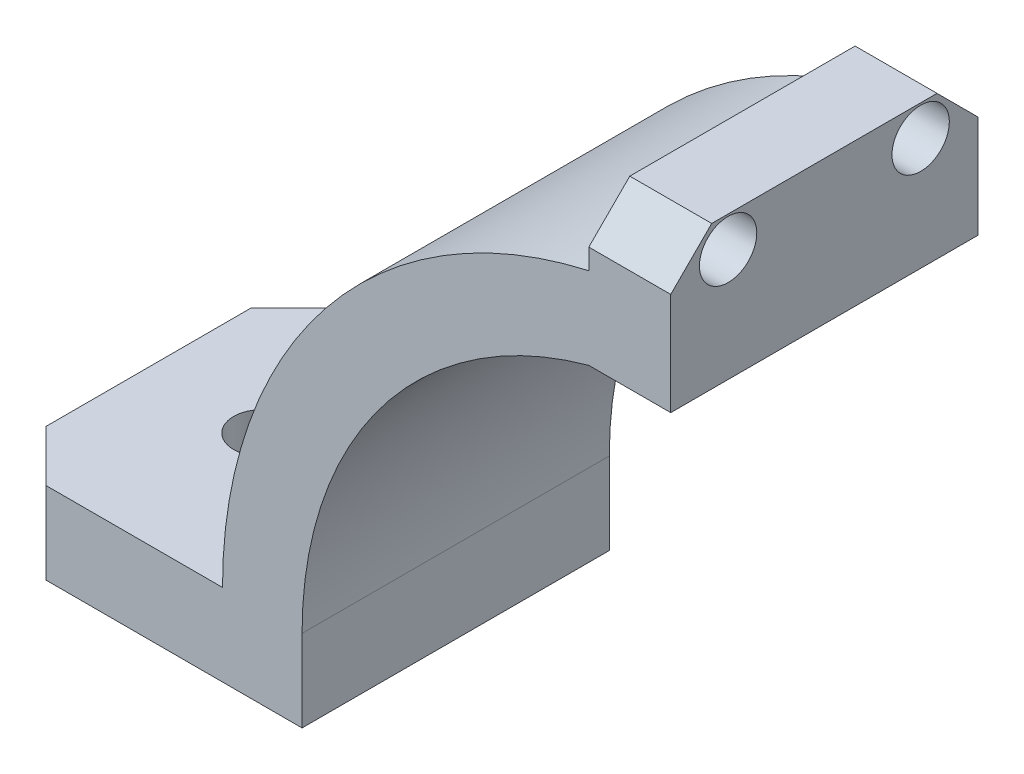
ISO-10303-21;
HEADER;
FILE_DESCRIPTION(('STEP AP214'),'2;1');
FILE_NAME('part.step','',(''),(''),'','','');
FILE_SCHEMA(('AUTOMOTIVE_DESIGN { 1 0 10303 214 1 1 1 1 }'));
ENDSEC;
DATA;
#1=APPLICATION_CONTEXT('core data for automotive mechanical design processes');
#2=APPLICATION_PROTOCOL_DEFINITION('international standard','automotive_design',2000,#1);
#3=PRODUCT_CONTEXT('',#1,'mechanical');
#4=PRODUCT('Part','Part','',(#3));
#5=PRODUCT_RELATED_PRODUCT_CATEGORY('part','',(#4));
#6=PRODUCT_DEFINITION_FORMATION('','',#4);
#7=PRODUCT_DEFINITION_CONTEXT('part definition',#1,'design');
#8=PRODUCT_DEFINITION('design','',#6,#7);
#9=PRODUCT_DEFINITION_SHAPE('','',#8);
#10=(LENGTH_UNIT() NAMED_UNIT(*) SI_UNIT(.MILLI.,.METRE.));
#11=(NAMED_UNIT(*) PLANE_ANGLE_UNIT() SI_UNIT($,.RADIAN.));
#12=(NAMED_UNIT(*) SI_UNIT($,.STERADIAN.) SOLID_ANGLE_UNIT());
#13=UNCERTAINTY_MEASURE_WITH_UNIT(LENGTH_MEASURE(1.E-05),#10,'distance_accuracy_value','');
#14=(GEOMETRIC_REPRESENTATION_CONTEXT(3) GLOBAL_UNCERTAINTY_ASSIGNED_CONTEXT((#13)) GLOBAL_UNIT_ASSIGNED_CONTEXT((#10,
#11,#12)) REPRESENTATION_CONTEXT('',''));
#15=CARTESIAN_POINT('',(0.,0.,0.));
#16=DIRECTION('',(0.,0.,1.));
#17=DIRECTION('',(1.,0.,0.));
#18=AXIS2_PLACEMENT_3D('',#15,#16,#17);
#19=CARTESIAN_POINT('',(0.,0.,15.));
#20=DIRECTION('',(0.,0.,-1.));
#21=DIRECTION('',(-1.,0.,0.));
#22=AXIS2_PLACEMENT_3D('',#19,#20,#21);
#23=CYLINDRICAL_SURFACE('',#22,19.);
#24=CARTESIAN_POINT('',(0.,0.,0.));
#25=DIRECTION('',(0.,0.,-1.));
#26=DIRECTION('',(-1.,0.,0.));
#27=AXIS2_PLACEMENT_3D('',#24,#25,#26);
#28=CIRCLE('',#27,19.);
#29=CARTESIAN_POINT('',(-19.,0.,0.));
#30=VERTEX_POINT('',#29);
#31=CARTESIAN_POINT('',(-5.,18.3303027798234,0.));
#32=VERTEX_POINT('',#31);
#33=EDGE_CURVE('E170',#30,#32,#28,.T.);
#34=ORIENTED_EDGE('',*,*,#33,.T.);
#35=DIRECTION('',(0.,0.,-1.));
#36=VECTOR('',#35,1.);
#37=CARTESIAN_POINT('',(-5.,18.3303027798234,15.));
#38=LINE('',#37,#36);
#39=CARTESIAN_POINT('',(-5.,18.3303027798234,15.));
#40=VERTEX_POINT('',#39);
#41=EDGE_CURVE('E150',#40,#32,#38,.T.);
#42=ORIENTED_EDGE('',*,*,#41,.F.);
#43=CARTESIAN_POINT('',(0.,0.,15.));
#44=DIRECTION('',(0.,0.,-1.));
#45=DIRECTION('',(-1.,0.,0.));
#46=AXIS2_PLACEMENT_3D('',#43,#44,#45);
#47=CIRCLE('',#46,19.);
#48=CARTESIAN_POINT('',(-19.,0.,15.));
#49=VERTEX_POINT('',#48);
#50=EDGE_CURVE('E158',#49,#40,#47,.T.);
#51=ORIENTED_EDGE('',*,*,#50,.F.);
#52=DIRECTION('',(0.,0.,-1.));
#53=VECTOR('',#52,1.);
#54=CARTESIAN_POINT('',(-19.,0.,15.));
#55=LINE('',#54,#53);
#56=EDGE_CURVE('E241',#49,#30,#55,.T.);
#57=ORIENTED_EDGE('',*,*,#56,.T.);
#58=EDGE_LOOP('',(#34,#42,#51,#57));
#59=FACE_BOUND('',#58,.T.);
#60=ADVANCED_FACE('F43',(#59),#23,.F.);
#61=CARTESIAN_POINT('',(-0.999999999999999,18.3303027798234,15.));
#62=DIRECTION('',(0.,1.,0.));
#63=DIRECTION('',(0.,0.,1.));
#64=AXIS2_PLACEMENT_3D('',#61,#62,#63);
#65=PLANE('',#64);
#66=DIRECTION('',(1.,0.,0.));
#67=VECTOR('',#66,1.);
#68=CARTESIAN_POINT('',(-0.999999999999999,18.3303027798234,0.));
#69=LINE('',#68,#67);
#70=CARTESIAN_POINT('',(-0.999999999999999,18.3303027798234,0.));
#71=VERTEX_POINT('',#70);
#72=EDGE_CURVE('E255',#32,#71,#69,.T.);
#73=ORIENTED_EDGE('',*,*,#72,.T.);
#74=DIRECTION('',(0.,0.,-1.));
#75=VECTOR('',#74,1.);
#76=CARTESIAN_POINT('',(-0.999999999999999,18.3303027798234,15.));
#77=LINE('',#76,#75);
#78=CARTESIAN_POINT('',(-0.999999999999999,18.3303027798234,15.));
#79=VERTEX_POINT('',#78);
#80=EDGE_CURVE('E153',#79,#71,#77,.T.);
#81=ORIENTED_EDGE('',*,*,#80,.F.);
#82=DIRECTION('',(1.,0.,0.));
#83=VECTOR('',#82,1.);
#84=CARTESIAN_POINT('',(-0.999999999999999,18.3303027798234,15.));
#85=LINE('',#84,#83);
#86=EDGE_CURVE('E146',#40,#79,#85,.T.);
#87=ORIENTED_EDGE('',*,*,#86,.F.);
#88=ORIENTED_EDGE('',*,*,#41,.T.);
#89=EDGE_LOOP('',(#73,#81,#87,#88));
#90=FACE_BOUND('',#89,.T.);
#91=ADVANCED_FACE('F148',(#90),#65,.F.);
#92=CARTESIAN_POINT('',(-1.,25.3303027798234,15.));
#93=DIRECTION('',(-1.,0.,0.));
#94=DIRECTION('',(0.,-1.,0.));
#95=AXIS2_PLACEMENT_3D('',#92,#93,#94);
#96=PLANE('',#95);
#97=CARTESIAN_POINT('',(-1.,23.8303027798234,2.8));
#98=DIRECTION('',(-1.,0.,0.));
#99=DIRECTION('',(0.,-1.,0.));
#100=AXIS2_PLACEMENT_3D('',#97,#98,#99);
#101=CIRCLE('',#100,1.4);
#102=CARTESIAN_POINT('',(-1.,22.4303027798234,2.8));
#103=VERTEX_POINT('',#102);
#104=EDGE_CURVE('E258',#103,#103,#101,.T.);
#105=ORIENTED_EDGE('',*,*,#104,.T.);
#106=EDGE_LOOP('',(#105));
#107=FACE_BOUND('',#106,.T.);
#108=CARTESIAN_POINT('',(-1.,23.8303027798234,12.2));
#109=DIRECTION('',(-1.,0.,0.));
#110=DIRECTION('',(0.,-1.,0.));
#111=AXIS2_PLACEMENT_3D('',#108,#109,#110);
#112=CIRCLE('',#111,1.4);
#113=CARTESIAN_POINT('',(-1.,22.4303027798234,12.2));
#114=VERTEX_POINT('',#113);
#115=EDGE_CURVE('E270',#114,#114,#112,.T.);
#116=ORIENTED_EDGE('',*,*,#115,.T.);
#117=EDGE_LOOP('',(#116));
#118=FACE_BOUND('',#117,.T.);
#119=DIRECTION('',(0.,0.,-1.));
#120=VECTOR('',#119,1.);
#121=CARTESIAN_POINT('',(-1.,25.3303027798234,15.));
#122=LINE('',#121,#120);
#123=CARTESIAN_POINT('',(-1.,25.3303027798234,13.));
#124=VERTEX_POINT('',#123);
#125=CARTESIAN_POINT('',(-1.,25.3303027798234,1.99999999999999));
#126=VERTEX_POINT('',#125);
#127=EDGE_CURVE('E175',#124,#126,#122,.T.);
#128=ORIENTED_EDGE('',*,*,#127,.F.);
#129=DIRECTION('',(0.,0.707106781186545,-0.70710678118655));
#130=VECTOR('',#129,1.);
#131=CARTESIAN_POINT('',(-1.,23.3303027798234,15.));
#132=LINE('',#131,#130);
#133=CARTESIAN_POINT('',(-1.,23.3303027798234,15.));
#134=VERTEX_POINT('',#133);
#135=EDGE_CURVE('E52',#124,#134,#132,.F.);
#136=ORIENTED_EDGE('',*,*,#135,.T.);
#137=DIRECTION('',(0.,1.,0.));
#138=VECTOR('',#137,1.);
#139=CARTESIAN_POINT('',(-1.,25.3303027798234,15.));
#140=LINE('',#139,#138);
#141=EDGE_CURVE('E157',#79,#134,#140,.T.);
#142=ORIENTED_EDGE('',*,*,#141,.F.);
#143=ORIENTED_EDGE('',*,*,#80,.T.);
#144=DIRECTION('',(0.,1.,0.));
#145=VECTOR('',#144,1.);
#146=CARTESIAN_POINT('',(-1.,25.3303027798234,0.));
#147=LINE('',#146,#145);
#148=CARTESIAN_POINT('',(-1.,23.3303027798233,0.));
#149=VERTEX_POINT('',#148);
#150=EDGE_CURVE('E253',#71,#149,#147,.T.);
#151=ORIENTED_EDGE('',*,*,#150,.T.);
#152=DIRECTION('',(0.,0.70710678118655,0.707106781186545));
#153=VECTOR('',#152,1.);
#154=CARTESIAN_POINT('',(-1.,25.3303027798234,2.));
#155=LINE('',#154,#153);
#156=EDGE_CURVE('E64',#149,#126,#155,.T.);
#157=ORIENTED_EDGE('',*,*,#156,.T.);
#158=EDGE_LOOP('',(#128,#136,#142,#143,#151,#157));
#159=FACE_BOUND('',#158,.T.);
#160=ADVANCED_FACE('F207',(#107,#118,#159),#96,.F.);
#161=CARTESIAN_POINT('',(-5.,25.3303027798234,15.));
#162=DIRECTION('',(0.,-1.,0.));
#163=DIRECTION('',(0.,0.,-1.));
#164=AXIS2_PLACEMENT_3D('',#161,#162,#163);
#165=PLANE('',#164);
#166=DIRECTION('',(0.,0.,-1.));
#167=VECTOR('',#166,1.);
#168=CARTESIAN_POINT('',(-5.,25.3303027798234,15.));
#169=LINE('',#168,#167);
#170=CARTESIAN_POINT('',(-5.,25.3303027798234,13.));
#171=VERTEX_POINT('',#170);
#172=CARTESIAN_POINT('',(-5.,25.3303027798234,1.99999999999999));
#173=VERTEX_POINT('',#172);
#174=EDGE_CURVE('E219',#171,#173,#169,.T.);
#175=ORIENTED_EDGE('',*,*,#174,.F.);
#176=DIRECTION('',(1.,0.,0.));
#177=VECTOR('',#176,1.);
#178=CARTESIAN_POINT('',(-5.,25.3303027798234,13.));
#179=LINE('',#178,#177);
#180=EDGE_CURVE('E204',#171,#124,#179,.T.);
#181=ORIENTED_EDGE('',*,*,#180,.T.);
#182=ORIENTED_EDGE('',*,*,#127,.T.);
#183=DIRECTION('',(-1.,0.,0.));
#184=VECTOR('',#183,1.);
#185=CARTESIAN_POINT('',(-5.,25.3303027798234,1.99999999999999));
#186=LINE('',#185,#184);
#187=EDGE_CURVE('E201',#126,#173,#186,.T.);
#188=ORIENTED_EDGE('',*,*,#187,.T.);
#189=EDGE_LOOP('',(#175,#181,#182,#188));
#190=FACE_BOUND('',#189,.T.);
#191=ADVANCED_FACE('F222',(#190),#165,.F.);
#192=CARTESIAN_POINT('',(-5.,22.3303027798234,15.));
#193=DIRECTION('',(1.,0.,0.));
#194=DIRECTION('',(0.,1.,0.));
#195=AXIS2_PLACEMENT_3D('',#192,#193,#194);
#196=PLANE('',#195);
#197=CARTESIAN_POINT('',(-5.00000000000001,23.8303027798234,2.8));
#198=DIRECTION('',(-1.,0.,0.));
#199=DIRECTION('',(0.,-1.,0.));
#200=AXIS2_PLACEMENT_3D('',#197,#198,#199);
#201=CIRCLE('',#200,1.4);
#202=CARTESIAN_POINT('',(-5.00000000000001,22.4303027798234,2.8));
#203=VERTEX_POINT('',#202);
#204=EDGE_CURVE('E273',#203,#203,#201,.T.);
#205=ORIENTED_EDGE('',*,*,#204,.F.);
#206=EDGE_LOOP('',(#205));
#207=FACE_BOUND('',#206,.T.);
#208=CARTESIAN_POINT('',(-5.00000000000001,23.8303027798234,12.2));
#209=DIRECTION('',(-1.,0.,0.));
#210=DIRECTION('',(0.,-1.,0.));
#211=AXIS2_PLACEMENT_3D('',#208,#209,#210);
#212=CIRCLE('',#211,1.4);
#213=CARTESIAN_POINT('',(-5.00000000000001,22.4303027798234,12.2));
#214=VERTEX_POINT('',#213);
#215=EDGE_CURVE('E274',#214,#214,#212,.T.);
#216=ORIENTED_EDGE('',*,*,#215,.F.);
#217=EDGE_LOOP('',(#216));
#218=FACE_BOUND('',#217,.T.);
#219=DIRECTION('',(0.,-1.,0.));
#220=VECTOR('',#219,1.);
#221=CARTESIAN_POINT('',(-5.,22.3303027798234,15.));
#222=LINE('',#221,#220);
#223=CARTESIAN_POINT('',(-5.,23.3303027798234,15.));
#224=VERTEX_POINT('',#223);
#225=CARTESIAN_POINT('',(-5.,22.3303027798234,15.));
#226=VERTEX_POINT('',#225);
#227=EDGE_CURVE('E212',#224,#226,#222,.T.);
#228=ORIENTED_EDGE('',*,*,#227,.F.);
#229=DIRECTION('',(0.,-0.707106781186545,0.70710678118655));
#230=VECTOR('',#229,1.);
#231=CARTESIAN_POINT('',(-5.,23.3303027798234,15.));
#232=LINE('',#231,#230);
#233=EDGE_CURVE('E199',#224,#171,#232,.F.);
#234=ORIENTED_EDGE('',*,*,#233,.T.);
#235=ORIENTED_EDGE('',*,*,#174,.T.);
#236=DIRECTION('',(0.,-0.70710678118655,-0.707106781186545));
#237=VECTOR('',#236,1.);
#238=CARTESIAN_POINT('',(-5.,25.3303027798234,1.99999999999999));
#239=LINE('',#238,#237);
#240=CARTESIAN_POINT('',(-5.,23.3303027798233,0.));
#241=VERTEX_POINT('',#240);
#242=EDGE_CURVE('E197',#173,#241,#239,.T.);
#243=ORIENTED_EDGE('',*,*,#242,.T.);
#244=DIRECTION('',(0.,-1.,0.));
#245=VECTOR('',#244,1.);
#246=CARTESIAN_POINT('',(-5.,22.3303027798234,0.));
#247=LINE('',#246,#245);
#248=CARTESIAN_POINT('',(-5.,22.3303027798234,0.));
#249=VERTEX_POINT('',#248);
#250=EDGE_CURVE('E251',#241,#249,#247,.T.);
#251=ORIENTED_EDGE('',*,*,#250,.T.);
#252=DIRECTION('',(0.,0.,-1.));
#253=VECTOR('',#252,1.);
#254=CARTESIAN_POINT('',(-5.,22.3303027798234,15.));
#255=LINE('',#254,#253);
#256=EDGE_CURVE('E224',#226,#249,#255,.T.);
#257=ORIENTED_EDGE('',*,*,#256,.F.);
#258=EDGE_LOOP('',(#228,#234,#235,#243,#251,#257));
#259=FACE_BOUND('',#258,.T.);
#260=ADVANCED_FACE('F218',(#207,#218,#259),#196,.F.);
#261=CARTESIAN_POINT('',(0.,0.,15.));
#262=DIRECTION('',(0.,0.,-1.));
#263=DIRECTION('',(-1.,0.,0.));
#264=AXIS2_PLACEMENT_3D('',#261,#262,#263);
#265=CYLINDRICAL_SURFACE('',#264,22.8832345230867);
#266=CARTESIAN_POINT('',(0.,0.,0.));
#267=DIRECTION('',(0.,0.,1.));
#268=DIRECTION('',(-1.,0.,0.));
#269=AXIS2_PLACEMENT_3D('',#266,#267,#268);
#270=CIRCLE('',#269,22.8832345230867);
#271=CARTESIAN_POINT('',(-22.8832345230867,0.,0.));
#272=VERTEX_POINT('',#271);
#273=EDGE_CURVE('E249',#249,#272,#270,.T.);
#274=ORIENTED_EDGE('',*,*,#273,.T.);
#275=DIRECTION('',(0.,0.,-1.));
#276=VECTOR('',#275,1.);
#277=CARTESIAN_POINT('',(-22.8832345230867,0.,15.));
#278=LINE('',#277,#276);
#279=CARTESIAN_POINT('',(-22.8832345230867,0.,15.));
#280=VERTEX_POINT('',#279);
#281=EDGE_CURVE('E227',#280,#272,#278,.T.);
#282=ORIENTED_EDGE('',*,*,#281,.F.);
#283=CARTESIAN_POINT('',(0.,0.,15.));
#284=DIRECTION('',(0.,0.,1.));
#285=DIRECTION('',(-1.,0.,0.));
#286=AXIS2_PLACEMENT_3D('',#283,#284,#285);
#287=CIRCLE('',#286,22.8832345230867);
#288=EDGE_CURVE('E265',#226,#280,#287,.T.);
#289=ORIENTED_EDGE('',*,*,#288,.F.);
#290=ORIENTED_EDGE('',*,*,#256,.T.);
#291=EDGE_LOOP('',(#274,#282,#289,#290));
#292=FACE_BOUND('',#291,.T.);
#293=ADVANCED_FACE('F299',(#292),#265,.T.);
#294=CARTESIAN_POINT('',(-34.,0.,15.));
#295=DIRECTION('',(0.,-1.,0.));
#296=DIRECTION('',(0.,0.,-1.));
#297=AXIS2_PLACEMENT_3D('',#294,#295,#296);
#298=PLANE('',#297);
#299=CARTESIAN_POINT('',(-28.4416172615434,0.,7.5));
#300=DIRECTION('',(0.,1.,0.));
#301=DIRECTION('',(0.,0.,1.));
#302=AXIS2_PLACEMENT_3D('',#299,#300,#301);
#303=CIRCLE('',#302,1.4);
#304=CARTESIAN_POINT('',(-28.4416172615434,0.,8.9));
#305=VERTEX_POINT('',#304);
#306=EDGE_CURVE('E280',#305,#305,#303,.T.);
#307=ORIENTED_EDGE('',*,*,#306,.F.);
#308=EDGE_LOOP('',(#307));
#309=FACE_BOUND('',#308,.T.);
#310=DIRECTION('',(-1.,0.,0.));
#311=VECTOR('',#310,1.);
#312=CARTESIAN_POINT('',(-34.,0.,0.));
#313=LINE('',#312,#311);
#314=CARTESIAN_POINT('',(-31.5,0.,0.));
#315=VERTEX_POINT('',#314);
#316=EDGE_CURVE('E246',#272,#315,#313,.T.);
#317=ORIENTED_EDGE('',*,*,#316,.T.);
#318=DIRECTION('',(-0.707106781186548,0.,0.707106781186548));
#319=VECTOR('',#318,1.);
#320=CARTESIAN_POINT('',(-34.,0.,2.50000000000001));
#321=LINE('',#320,#319);
#322=CARTESIAN_POINT('',(-34.,0.,2.50000000000001));
#323=VERTEX_POINT('',#322);
#324=EDGE_CURVE('E189',#315,#323,#321,.T.);
#325=ORIENTED_EDGE('',*,*,#324,.T.);
#326=DIRECTION('',(0.,0.,-1.));
#327=VECTOR('',#326,1.);
#328=CARTESIAN_POINT('',(-34.,0.,15.));
#329=LINE('',#328,#327);
#330=CARTESIAN_POINT('',(-34.,0.,12.5));
#331=VERTEX_POINT('',#330);
#332=EDGE_CURVE('E232',#331,#323,#329,.T.);
#333=ORIENTED_EDGE('',*,*,#332,.F.);
#334=DIRECTION('',(-0.707106781186547,0.,-0.707106781186549));
#335=VECTOR('',#334,1.);
#336=CARTESIAN_POINT('',(-31.5,0.,15.));
#337=LINE('',#336,#335);
#338=CARTESIAN_POINT('',(-31.5,0.,15.));
#339=VERTEX_POINT('',#338);
#340=EDGE_CURVE('E187',#331,#339,#337,.F.);
#341=ORIENTED_EDGE('',*,*,#340,.T.);
#342=DIRECTION('',(-1.,0.,0.));
#343=VECTOR('',#342,1.);
#344=CARTESIAN_POINT('',(-34.,0.,15.));
#345=LINE('',#344,#343);
#346=EDGE_CURVE('E262',#280,#339,#345,.T.);
#347=ORIENTED_EDGE('',*,*,#346,.F.);
#348=ORIENTED_EDGE('',*,*,#281,.T.);
#349=EDGE_LOOP('',(#317,#325,#333,#341,#347,#348));
#350=FACE_BOUND('',#349,.T.);
#351=ADVANCED_FACE('F295',(#309,#350),#298,.F.);
#352=CARTESIAN_POINT('',(-34.,-4.,15.));
#353=DIRECTION('',(1.,0.,0.));
#354=DIRECTION('',(0.,1.,0.));
#355=AXIS2_PLACEMENT_3D('',#352,#353,#354);
#356=PLANE('',#355);
#357=ORIENTED_EDGE('',*,*,#332,.T.);
#358=DIRECTION('',(0.,-1.,0.));
#359=VECTOR('',#358,1.);
#360=CARTESIAN_POINT('',(-34.,-4.,2.50000000000001));
#361=LINE('',#360,#359);
#362=CARTESIAN_POINT('',(-34.,-4.,2.50000000000001));
#363=VERTEX_POINT('',#362);
#364=EDGE_CURVE('E173',#323,#363,#361,.T.);
#365=ORIENTED_EDGE('',*,*,#364,.T.);
#366=DIRECTION('',(0.,0.,-1.));
#367=VECTOR('',#366,1.);
#368=CARTESIAN_POINT('',(-34.,-4.,15.));
#369=LINE('',#368,#367);
#370=CARTESIAN_POINT('',(-34.,-4.,12.5));
#371=VERTEX_POINT('',#370);
#372=EDGE_CURVE('E235',#371,#363,#369,.T.);
#373=ORIENTED_EDGE('',*,*,#372,.F.);
#374=DIRECTION('',(0.,1.,0.));
#375=VECTOR('',#374,1.);
#376=CARTESIAN_POINT('',(-34.,-4.,12.5));
#377=LINE('',#376,#375);
#378=EDGE_CURVE('E171',#371,#331,#377,.T.);
#379=ORIENTED_EDGE('',*,*,#378,.T.);
#380=EDGE_LOOP('',(#357,#365,#373,#379));
#381=FACE_BOUND('',#380,.T.);
#382=ADVANCED_FACE('F298',(#381),#356,.F.);
#383=CARTESIAN_POINT('',(-19.,-4.,15.));
#384=DIRECTION('',(0.,1.,0.));
#385=DIRECTION('',(-1.,0.,0.));
#386=AXIS2_PLACEMENT_3D('',#383,#384,#385);
#387=PLANE('',#386);
#388=CARTESIAN_POINT('',(-28.4416172615434,-4.,7.5));
#389=DIRECTION('',(0.,1.,0.));
#390=DIRECTION('',(0.,0.,1.));
#391=AXIS2_PLACEMENT_3D('',#388,#389,#390);
#392=CIRCLE('',#391,1.4);
#393=CARTESIAN_POINT('',(-28.4416172615434,-4.,8.9));
#394=VERTEX_POINT('',#393);
#395=EDGE_CURVE('E277',#394,#394,#392,.T.);
#396=ORIENTED_EDGE('',*,*,#395,.T.);
#397=EDGE_LOOP('',(#396));
#398=FACE_BOUND('',#397,.T.);
#399=ORIENTED_EDGE('',*,*,#372,.T.);
#400=DIRECTION('',(0.707106781186548,0.,-0.707106781186548));
#401=VECTOR('',#400,1.);
#402=CARTESIAN_POINT('',(-34.,-4.,2.50000000000001));
#403=LINE('',#402,#401);
#404=CARTESIAN_POINT('',(-31.5,-4.,0.));
#405=VERTEX_POINT('',#404);
#406=EDGE_CURVE('E183',#363,#405,#403,.T.);
#407=ORIENTED_EDGE('',*,*,#406,.T.);
#408=DIRECTION('',(1.,0.,0.));
#409=VECTOR('',#408,1.);
#410=CARTESIAN_POINT('',(-19.,-4.,0.));
#411=LINE('',#410,#409);
#412=CARTESIAN_POINT('',(-19.,-4.,0.));
#413=VERTEX_POINT('',#412);
#414=EDGE_CURVE('E244',#405,#413,#411,.T.);
#415=ORIENTED_EDGE('',*,*,#414,.T.);
#416=DIRECTION('',(0.,0.,-1.));
#417=VECTOR('',#416,1.);
#418=CARTESIAN_POINT('',(-19.,-4.,15.));
#419=LINE('',#418,#417);
#420=CARTESIAN_POINT('',(-19.,-4.,15.));
#421=VERTEX_POINT('',#420);
#422=EDGE_CURVE('E238',#421,#413,#419,.T.);
#423=ORIENTED_EDGE('',*,*,#422,.F.);
#424=DIRECTION('',(1.,0.,0.));
#425=VECTOR('',#424,1.);
#426=CARTESIAN_POINT('',(-19.,-4.,15.));
#427=LINE('',#426,#425);
#428=CARTESIAN_POINT('',(-31.5,-4.,15.));
#429=VERTEX_POINT('',#428);
#430=EDGE_CURVE('E260',#429,#421,#427,.T.);
#431=ORIENTED_EDGE('',*,*,#430,.F.);
#432=DIRECTION('',(0.707106781186547,0.,0.707106781186549));
#433=VECTOR('',#432,1.);
#434=CARTESIAN_POINT('',(-31.5,-4.,15.));
#435=LINE('',#434,#433);
#436=EDGE_CURVE('E181',#429,#371,#435,.F.);
#437=ORIENTED_EDGE('',*,*,#436,.T.);
#438=EDGE_LOOP('',(#399,#407,#415,#423,#431,#437));
#439=FACE_BOUND('',#438,.T.);
#440=ADVANCED_FACE('F286',(#398,#439),#387,.F.);
#441=CARTESIAN_POINT('',(-19.,0.,15.));
#442=DIRECTION('',(-1.,0.,0.));
#443=DIRECTION('',(0.,-1.,0.));
#444=AXIS2_PLACEMENT_3D('',#441,#442,#443);
#445=PLANE('',#444);
#446=DIRECTION('',(0.,1.,0.));
#447=VECTOR('',#446,1.);
#448=CARTESIAN_POINT('',(-19.,0.,0.));
#449=LINE('',#448,#447);
#450=EDGE_CURVE('E167',#413,#30,#449,.T.);
#451=ORIENTED_EDGE('',*,*,#450,.T.);
#452=ORIENTED_EDGE('',*,*,#56,.F.);
#453=DIRECTION('',(0.,1.,0.));
#454=VECTOR('',#453,1.);
#455=CARTESIAN_POINT('',(-19.,0.,15.));
#456=LINE('',#455,#454);
#457=EDGE_CURVE('E163',#421,#49,#456,.T.);
#458=ORIENTED_EDGE('',*,*,#457,.F.);
#459=ORIENTED_EDGE('',*,*,#422,.T.);
#460=EDGE_LOOP('',(#451,#452,#458,#459));
#461=FACE_BOUND('',#460,.T.);
#462=ADVANCED_FACE('F367',(#461),#445,.F.);
#463=CARTESIAN_POINT('',(0.,0.,15.));
#464=DIRECTION('',(0.,0.,-1.));
#465=DIRECTION('',(-1.,0.,0.));
#466=AXIS2_PLACEMENT_3D('',#463,#464,#465);
#467=PLANE('',#466);
#468=ORIENTED_EDGE('',*,*,#141,.T.);
#469=DIRECTION('',(-1.,0.,0.));
#470=VECTOR('',#469,1.);
#471=CARTESIAN_POINT('',(0.,23.3303027798234,15.));
#472=LINE('',#471,#470);
#473=EDGE_CURVE('E194',#134,#224,#472,.T.);
#474=ORIENTED_EDGE('',*,*,#473,.T.);
#475=ORIENTED_EDGE('',*,*,#227,.T.);
#476=ORIENTED_EDGE('',*,*,#288,.T.);
#477=ORIENTED_EDGE('',*,*,#346,.T.);
#478=DIRECTION('',(0.,-1.,0.));
#479=VECTOR('',#478,1.);
#480=CARTESIAN_POINT('',(-31.5,0.,15.));
#481=LINE('',#480,#479);
#482=EDGE_CURVE('E191',#339,#429,#481,.T.);
#483=ORIENTED_EDGE('',*,*,#482,.T.);
#484=ORIENTED_EDGE('',*,*,#430,.T.);
#485=ORIENTED_EDGE('',*,*,#457,.T.);
#486=ORIENTED_EDGE('',*,*,#50,.T.);
#487=ORIENTED_EDGE('',*,*,#86,.T.);
#488=EDGE_LOOP('',(#468,#474,#475,#476,#477,#483,#484,#485,#486,#487));
#489=FACE_BOUND('',#488,.T.);
#490=ADVANCED_FACE('F161',(#489),#467,.F.);
#491=CARTESIAN_POINT('',(0.,0.,0.));
#492=DIRECTION('',(0.,0.,-1.));
#493=DIRECTION('',(-1.,0.,0.));
#494=AXIS2_PLACEMENT_3D('',#491,#492,#493);
#495=PLANE('',#494);
#496=ORIENTED_EDGE('',*,*,#250,.F.);
#497=DIRECTION('',(1.,0.,0.));
#498=VECTOR('',#497,1.);
#499=CARTESIAN_POINT('',(-1.,23.3303027798233,0.));
#500=LINE('',#499,#498);
#501=EDGE_CURVE('E11',#241,#149,#500,.T.);
#502=ORIENTED_EDGE('',*,*,#501,.T.);
#503=ORIENTED_EDGE('',*,*,#150,.F.);
#504=ORIENTED_EDGE('',*,*,#72,.F.);
#505=ORIENTED_EDGE('',*,*,#33,.F.);
#506=ORIENTED_EDGE('',*,*,#450,.F.);
#507=ORIENTED_EDGE('',*,*,#414,.F.);
#508=DIRECTION('',(0.,1.,0.));
#509=VECTOR('',#508,1.);
#510=CARTESIAN_POINT('',(-31.5,0.,0.));
#511=LINE('',#510,#509);
#512=EDGE_CURVE('E185',#405,#315,#511,.T.);
#513=ORIENTED_EDGE('',*,*,#512,.T.);
#514=ORIENTED_EDGE('',*,*,#316,.F.);
#515=ORIENTED_EDGE('',*,*,#273,.F.);
#516=EDGE_LOOP('',(#496,#502,#503,#504,#505,#506,#507,#513,#514,#515));
#517=FACE_BOUND('',#516,.T.);
#518=ADVANCED_FACE('F323',(#517),#495,.T.);
#519=CARTESIAN_POINT('',(-34.,-4.,2.50000000000001));
#520=DIRECTION('',(-0.707106781186547,0.,-0.707106781186547));
#521=DIRECTION('',(0.,1.,0.));
#522=AXIS2_PLACEMENT_3D('',#519,#520,#521);
#523=PLANE('',#522);
#524=ORIENTED_EDGE('',*,*,#324,.F.);
#525=ORIENTED_EDGE('',*,*,#512,.F.);
#526=ORIENTED_EDGE('',*,*,#406,.F.);
#527=ORIENTED_EDGE('',*,*,#364,.F.);
#528=EDGE_LOOP('',(#524,#525,#526,#527));
#529=FACE_BOUND('',#528,.T.);
#530=ADVANCED_FACE('F310',(#529),#523,.T.);
#531=CARTESIAN_POINT('',(-31.5,0.,15.));
#532=DIRECTION('',(0.707106781186548,0.,-0.707106781186546));
#533=DIRECTION('',(0.,-1.,0.));
#534=AXIS2_PLACEMENT_3D('',#531,#532,#533);
#535=PLANE('',#534);
#536=ORIENTED_EDGE('',*,*,#340,.F.);
#537=ORIENTED_EDGE('',*,*,#378,.F.);
#538=ORIENTED_EDGE('',*,*,#436,.F.);
#539=ORIENTED_EDGE('',*,*,#482,.F.);
#540=EDGE_LOOP('',(#536,#537,#538,#539));
#541=FACE_BOUND('',#540,.T.);
#542=ADVANCED_FACE('F320',(#541),#535,.F.);
#543=CARTESIAN_POINT('',(9.99999999999999,23.8303027798234,12.2));
#544=DIRECTION('',(-1.,0.,0.));
#545=DIRECTION('',(0.,-1.,0.));
#546=AXIS2_PLACEMENT_3D('',#543,#544,#545);
#547=CYLINDRICAL_SURFACE('',#546,1.4);
#548=ORIENTED_EDGE('',*,*,#215,.T.);
#549=EDGE_LOOP('',(#548));
#550=FACE_BOUND('',#549,.T.);
#551=ORIENTED_EDGE('',*,*,#115,.F.);
#552=EDGE_LOOP('',(#551));
#553=FACE_BOUND('',#552,.T.);
#554=ADVANCED_FACE('F348',(#550,#553),#547,.F.);
#555=CARTESIAN_POINT('',(9.99999999999999,23.8303027798234,2.8));
#556=DIRECTION('',(-1.,0.,0.));
#557=DIRECTION('',(0.,-1.,0.));
#558=AXIS2_PLACEMENT_3D('',#555,#556,#557);
#559=CYLINDRICAL_SURFACE('',#558,1.4);
#560=ORIENTED_EDGE('',*,*,#204,.T.);
#561=EDGE_LOOP('',(#560));
#562=FACE_BOUND('',#561,.T.);
#563=ORIENTED_EDGE('',*,*,#104,.F.);
#564=EDGE_LOOP('',(#563));
#565=FACE_BOUND('',#564,.T.);
#566=ADVANCED_FACE('F329',(#562,#565),#559,.F.);
#567=CARTESIAN_POINT('',(0.,23.3303027798234,15.));
#568=DIRECTION('',(0.,-0.70710678118655,-0.707106781186545));
#569=DIRECTION('',(-1.,0.,0.));
#570=AXIS2_PLACEMENT_3D('',#567,#568,#569);
#571=PLANE('',#570);
#572=ORIENTED_EDGE('',*,*,#135,.F.);
#573=ORIENTED_EDGE('',*,*,#180,.F.);
#574=ORIENTED_EDGE('',*,*,#233,.F.);
#575=ORIENTED_EDGE('',*,*,#473,.F.);
#576=EDGE_LOOP('',(#572,#573,#574,#575));
#577=FACE_BOUND('',#576,.T.);
#578=ADVANCED_FACE('F214',(#577),#571,.F.);
#579=CARTESIAN_POINT('',(-5.,25.3303027798234,1.99999999999999));
#580=DIRECTION('',(0.,0.707106781186545,-0.70710678118655));
#581=DIRECTION('',(1.,0.,0.));
#582=AXIS2_PLACEMENT_3D('',#579,#580,#581);
#583=PLANE('',#582);
#584=ORIENTED_EDGE('',*,*,#156,.F.);
#585=ORIENTED_EDGE('',*,*,#501,.F.);
#586=ORIENTED_EDGE('',*,*,#242,.F.);
#587=ORIENTED_EDGE('',*,*,#187,.F.);
#588=EDGE_LOOP('',(#584,#585,#586,#587));
#589=FACE_BOUND('',#588,.T.);
#590=ADVANCED_FACE('F46',(#589),#583,.T.);
#591=CARTESIAN_POINT('',(-28.4416172615434,-4.,7.5));
#592=DIRECTION('',(0.,1.,0.));
#593=DIRECTION('',(0.,0.,1.));
#594=AXIS2_PLACEMENT_3D('',#591,#592,#593);
#595=CYLINDRICAL_SURFACE('',#594,1.4);
#596=ORIENTED_EDGE('',*,*,#395,.F.);
#597=EDGE_LOOP('',(#596));
#598=FACE_BOUND('',#597,.T.);
#599=ORIENTED_EDGE('',*,*,#306,.T.);
#600=EDGE_LOOP('',(#599));
#601=FACE_BOUND('',#600,.T.);
#602=ADVANCED_FACE('F289',(#598,#601),#595,.F.);
#603=CLOSED_SHELL('',(#60,#91,#160,#191,#260,#293,#351,#382,#440,#462,#490,#518,#530,#542,#554,
#566,#578,#590,#602));
#604=MANIFOLD_SOLID_BREP('B2',#603);
#605=ADVANCED_BREP_SHAPE_REPRESENTATION('',(#18,#604),#14);
#606=SHAPE_DEFINITION_REPRESENTATION(#9,#605);
ENDSEC;
END-ISO-10303-21;
